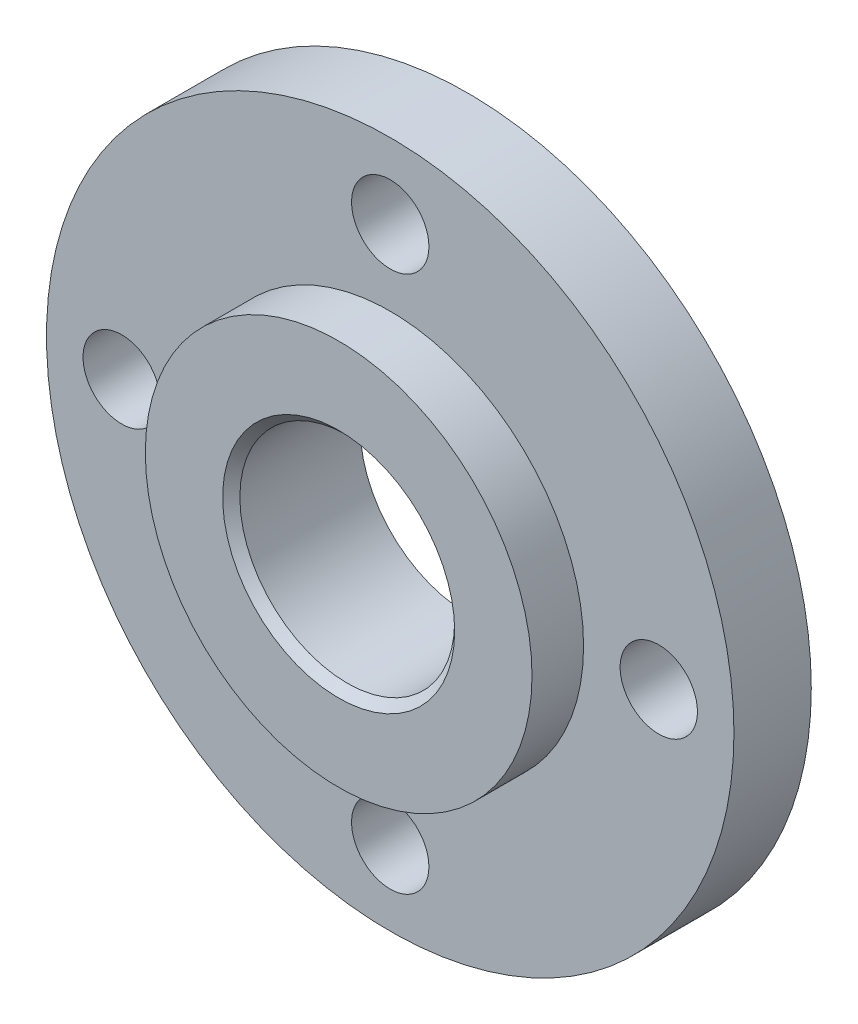
ISO-10303-21;
HEADER;
FILE_DESCRIPTION(('STEP AP214'),'2;1');
FILE_NAME('part.step','',(''),(''),'','','');
FILE_SCHEMA(('AUTOMOTIVE_DESIGN { 1 0 10303 214 1 1 1 1 }'));
ENDSEC;
DATA;
#1=APPLICATION_CONTEXT('core data for automotive mechanical design processes');
#2=APPLICATION_PROTOCOL_DEFINITION('international standard','automotive_design',2000,#1);
#3=PRODUCT_CONTEXT('',#1,'mechanical');
#4=PRODUCT('Part','Part','',(#3));
#5=PRODUCT_RELATED_PRODUCT_CATEGORY('part','',(#4));
#6=PRODUCT_DEFINITION_FORMATION('','',#4);
#7=PRODUCT_DEFINITION_CONTEXT('part definition',#1,'design');
#8=PRODUCT_DEFINITION('design','',#6,#7);
#9=PRODUCT_DEFINITION_SHAPE('','',#8);
#10=(LENGTH_UNIT() NAMED_UNIT(*) SI_UNIT(.MILLI.,.METRE.));
#11=(NAMED_UNIT(*) PLANE_ANGLE_UNIT() SI_UNIT($,.RADIAN.));
#12=(NAMED_UNIT(*) SI_UNIT($,.STERADIAN.) SOLID_ANGLE_UNIT());
#13=UNCERTAINTY_MEASURE_WITH_UNIT(LENGTH_MEASURE(1.E-05),#10,'distance_accuracy_value','');
#14=(GEOMETRIC_REPRESENTATION_CONTEXT(3) GLOBAL_UNCERTAINTY_ASSIGNED_CONTEXT((#13)) GLOBAL_UNIT_ASSIGNED_CONTEXT((#10,
#11,#12)) REPRESENTATION_CONTEXT('',''));
#15=CARTESIAN_POINT('',(0.,0.,0.));
#16=DIRECTION('',(0.,0.,1.));
#17=DIRECTION('',(1.,0.,0.));
#18=AXIS2_PLACEMENT_3D('',#15,#16,#17);
#19=CARTESIAN_POINT('',(0.,0.,18.));
#20=DIRECTION('',(0.,0.,-1.));
#21=DIRECTION('',(-1.,0.,0.));
#22=AXIS2_PLACEMENT_3D('',#19,#20,#21);
#23=CYLINDRICAL_SURFACE('',#22,80.);
#24=CARTESIAN_POINT('',(0.,0.,18.));
#25=DIRECTION('',(0.,0.,1.));
#26=DIRECTION('',(1.,0.,0.));
#27=AXIS2_PLACEMENT_3D('',#24,#25,#26);
#28=CIRCLE('',#27,80.);
#29=CARTESIAN_POINT('',(80.,0.,18.));
#30=VERTEX_POINT('',#29);
#31=EDGE_CURVE('E71',#30,#30,#28,.T.);
#32=ORIENTED_EDGE('',*,*,#31,.F.);
#33=EDGE_LOOP('',(#32));
#34=FACE_BOUND('',#33,.T.);
#35=CARTESIAN_POINT('',(0.,0.,0.));
#36=DIRECTION('',(0.,0.,1.));
#37=DIRECTION('',(1.,0.,0.));
#38=AXIS2_PLACEMENT_3D('',#35,#36,#37);
#39=CIRCLE('',#38,80.);
#40=CARTESIAN_POINT('',(80.,0.,0.));
#41=VERTEX_POINT('',#40);
#42=EDGE_CURVE('E78',#41,#41,#39,.T.);
#43=ORIENTED_EDGE('',*,*,#42,.T.);
#44=EDGE_LOOP('',(#43));
#45=FACE_BOUND('',#44,.T.);
#46=ADVANCED_FACE('F55',(#34,#45),#23,.T.);
#47=CARTESIAN_POINT('',(0.,0.,18.));
#48=DIRECTION('',(0.,0.,1.));
#49=DIRECTION('',(1.,0.,0.));
#50=AXIS2_PLACEMENT_3D('',#47,#48,#49);
#51=PLANE('',#50);
#52=CARTESIAN_POINT('',(62.5,0.,18.));
#53=DIRECTION('',(0.,0.,1.));
#54=DIRECTION('',(1.,0.,0.));
#55=AXIS2_PLACEMENT_3D('',#52,#53,#54);
#56=CIRCLE('',#55,9.00000000000001);
#57=CARTESIAN_POINT('',(71.5,0.,18.));
#58=VERTEX_POINT('',#57);
#59=EDGE_CURVE('E96',#58,#58,#56,.F.);
#60=ORIENTED_EDGE('',*,*,#59,.T.);
#61=EDGE_LOOP('',(#60));
#62=FACE_BOUND('',#61,.T.);
#63=CARTESIAN_POINT('',(0.,62.5,18.));
#64=DIRECTION('',(0.,0.,1.));
#65=DIRECTION('',(1.,0.,0.));
#66=AXIS2_PLACEMENT_3D('',#63,#64,#65);
#67=CIRCLE('',#66,9.00000000000001);
#68=CARTESIAN_POINT('',(9.00000000000001,62.5,18.));
#69=VERTEX_POINT('',#68);
#70=EDGE_CURVE('E100',#69,#69,#67,.F.);
#71=ORIENTED_EDGE('',*,*,#70,.T.);
#72=EDGE_LOOP('',(#71));
#73=FACE_BOUND('',#72,.T.);
#74=CARTESIAN_POINT('',(-62.5,0.,18.));
#75=DIRECTION('',(0.,0.,1.));
#76=DIRECTION('',(1.,0.,0.));
#77=AXIS2_PLACEMENT_3D('',#74,#75,#76);
#78=CIRCLE('',#77,9.);
#79=CARTESIAN_POINT('',(-53.5,0.,18.));
#80=VERTEX_POINT('',#79);
#81=EDGE_CURVE('E104',#80,#80,#78,.F.);
#82=ORIENTED_EDGE('',*,*,#81,.T.);
#83=EDGE_LOOP('',(#82));
#84=FACE_BOUND('',#83,.T.);
#85=CARTESIAN_POINT('',(0.,-62.5,18.));
#86=DIRECTION('',(0.,0.,1.));
#87=DIRECTION('',(1.,0.,0.));
#88=AXIS2_PLACEMENT_3D('',#85,#86,#87);
#89=CIRCLE('',#88,8.99999999999999);
#90=CARTESIAN_POINT('',(8.99999999999999,-62.5,18.));
#91=VERTEX_POINT('',#90);
#92=EDGE_CURVE('E108',#91,#91,#89,.F.);
#93=ORIENTED_EDGE('',*,*,#92,.T.);
#94=EDGE_LOOP('',(#93));
#95=FACE_BOUND('',#94,.T.);
#96=CARTESIAN_POINT('',(0.,0.,18.));
#97=DIRECTION('',(0.,0.,1.));
#98=DIRECTION('',(1.,0.,0.));
#99=AXIS2_PLACEMENT_3D('',#96,#97,#98);
#100=CIRCLE('',#99,45.);
#101=CARTESIAN_POINT('',(45.,0.,18.));
#102=VERTEX_POINT('',#101);
#103=EDGE_CURVE('E83',#102,#102,#100,.F.);
#104=ORIENTED_EDGE('',*,*,#103,.T.);
#105=EDGE_LOOP('',(#104));
#106=FACE_BOUND('',#105,.T.);
#107=ORIENTED_EDGE('',*,*,#31,.T.);
#108=EDGE_LOOP('',(#107));
#109=FACE_BOUND('',#108,.T.);
#110=ADVANCED_FACE('F149',(#62,#73,#84,#95,#106,#109),#51,.T.);
#111=CARTESIAN_POINT('',(0.,0.,0.));
#112=DIRECTION('',(0.,0.,1.));
#113=DIRECTION('',(1.,0.,0.));
#114=AXIS2_PLACEMENT_3D('',#111,#112,#113);
#115=PLANE('',#114);
#116=CARTESIAN_POINT('',(62.5,0.,0.));
#117=DIRECTION('',(0.,0.,1.));
#118=DIRECTION('',(1.,0.,0.));
#119=AXIS2_PLACEMENT_3D('',#116,#117,#118);
#120=CIRCLE('',#119,9.00000000000001);
#121=CARTESIAN_POINT('',(71.5,0.,0.));
#122=VERTEX_POINT('',#121);
#123=EDGE_CURVE('E112',#122,#122,#120,.T.);
#124=ORIENTED_EDGE('',*,*,#123,.T.);
#125=EDGE_LOOP('',(#124));
#126=FACE_BOUND('',#125,.T.);
#127=CARTESIAN_POINT('',(0.,62.5,0.));
#128=DIRECTION('',(0.,0.,1.));
#129=DIRECTION('',(1.,0.,0.));
#130=AXIS2_PLACEMENT_3D('',#127,#128,#129);
#131=CIRCLE('',#130,9.00000000000001);
#132=CARTESIAN_POINT('',(9.00000000000001,62.5,0.));
#133=VERTEX_POINT('',#132);
#134=EDGE_CURVE('E121',#133,#133,#131,.T.);
#135=ORIENTED_EDGE('',*,*,#134,.T.);
#136=EDGE_LOOP('',(#135));
#137=FACE_BOUND('',#136,.T.);
#138=CARTESIAN_POINT('',(-62.5,0.,0.));
#139=DIRECTION('',(0.,0.,1.));
#140=DIRECTION('',(1.,0.,0.));
#141=AXIS2_PLACEMENT_3D('',#138,#139,#140);
#142=CIRCLE('',#141,9.);
#143=CARTESIAN_POINT('',(-53.5,0.,0.));
#144=VERTEX_POINT('',#143);
#145=EDGE_CURVE('E117',#144,#144,#142,.T.);
#146=ORIENTED_EDGE('',*,*,#145,.T.);
#147=EDGE_LOOP('',(#146));
#148=FACE_BOUND('',#147,.T.);
#149=CARTESIAN_POINT('',(0.,-62.5,0.));
#150=DIRECTION('',(0.,0.,1.));
#151=DIRECTION('',(1.,0.,0.));
#152=AXIS2_PLACEMENT_3D('',#149,#150,#151);
#153=CIRCLE('',#152,8.99999999999999);
#154=CARTESIAN_POINT('',(8.99999999999999,-62.5,0.));
#155=VERTEX_POINT('',#154);
#156=EDGE_CURVE('E113',#155,#155,#153,.T.);
#157=ORIENTED_EDGE('',*,*,#156,.T.);
#158=EDGE_LOOP('',(#157));
#159=FACE_BOUND('',#158,.T.);
#160=CARTESIAN_POINT('',(0.,0.,0.));
#161=DIRECTION('',(0.,0.,1.));
#162=DIRECTION('',(1.,0.,0.));
#163=AXIS2_PLACEMENT_3D('',#160,#161,#162);
#164=CIRCLE('',#163,25.);
#165=CARTESIAN_POINT('',(25.,0.,0.));
#166=VERTEX_POINT('',#165);
#167=EDGE_CURVE('E92',#166,#166,#164,.T.);
#168=ORIENTED_EDGE('',*,*,#167,.T.);
#169=EDGE_LOOP('',(#168));
#170=FACE_BOUND('',#169,.T.);
#171=ORIENTED_EDGE('',*,*,#42,.F.);
#172=EDGE_LOOP('',(#171));
#173=FACE_BOUND('',#172,.T.);
#174=ADVANCED_FACE('F131',(#126,#137,#148,#159,#170,#173),#115,.F.);
#175=CARTESIAN_POINT('',(0.,0.,30.));
#176=DIRECTION('',(0.,0.,-1.));
#177=DIRECTION('',(-1.,0.,0.));
#178=AXIS2_PLACEMENT_3D('',#175,#176,#177);
#179=CYLINDRICAL_SURFACE('',#178,45.);
#180=ORIENTED_EDGE('',*,*,#103,.F.);
#181=EDGE_LOOP('',(#180));
#182=FACE_BOUND('',#181,.T.);
#183=CARTESIAN_POINT('',(0.,0.,30.));
#184=DIRECTION('',(0.,0.,1.));
#185=DIRECTION('',(1.,0.,0.));
#186=AXIS2_PLACEMENT_3D('',#183,#184,#185);
#187=CIRCLE('',#186,45.);
#188=CARTESIAN_POINT('',(45.,0.,30.));
#189=VERTEX_POINT('',#188);
#190=EDGE_CURVE('E88',#189,#189,#187,.T.);
#191=ORIENTED_EDGE('',*,*,#190,.F.);
#192=EDGE_LOOP('',(#191));
#193=FACE_BOUND('',#192,.T.);
#194=ADVANCED_FACE('F160',(#182,#193),#179,.T.);
#195=CARTESIAN_POINT('',(0.,0.,30.));
#196=DIRECTION('',(0.,0.,1.));
#197=DIRECTION('',(1.,0.,0.));
#198=AXIS2_PLACEMENT_3D('',#195,#196,#197);
#199=PLANE('',#198);
#200=CARTESIAN_POINT('',(0.,0.,30.));
#201=DIRECTION('',(0.,0.,1.));
#202=DIRECTION('',(1.,0.,0.));
#203=AXIS2_PLACEMENT_3D('',#200,#201,#202);
#204=CIRCLE('',#203,27.);
#205=CARTESIAN_POINT('',(27.,0.,30.));
#206=VERTEX_POINT('',#205);
#207=EDGE_CURVE('E12',#206,#206,#204,.F.);
#208=ORIENTED_EDGE('',*,*,#207,.T.);
#209=EDGE_LOOP('',(#208));
#210=FACE_BOUND('',#209,.T.);
#211=ORIENTED_EDGE('',*,*,#190,.T.);
#212=EDGE_LOOP('',(#211));
#213=FACE_BOUND('',#212,.T.);
#214=ADVANCED_FACE('F164',(#210,#213),#199,.T.);
#215=CARTESIAN_POINT('',(0.,0.,30.));
#216=DIRECTION('',(0.,0.,-1.));
#217=DIRECTION('',(-1.,0.,0.));
#218=AXIS2_PLACEMENT_3D('',#215,#216,#217);
#219=CYLINDRICAL_SURFACE('',#218,25.);
#220=CARTESIAN_POINT('',(0.,0.,28.0000000000001));
#221=DIRECTION('',(0.,0.,1.));
#222=DIRECTION('',(1.,0.,0.));
#223=AXIS2_PLACEMENT_3D('',#220,#221,#222);
#224=CIRCLE('',#223,25.);
#225=CARTESIAN_POINT('',(25.,0.,28.0000000000001));
#226=VERTEX_POINT('',#225);
#227=EDGE_CURVE('E64',#226,#226,#224,.T.);
#228=ORIENTED_EDGE('',*,*,#227,.T.);
#229=EDGE_LOOP('',(#228));
#230=FACE_BOUND('',#229,.T.);
#231=ORIENTED_EDGE('',*,*,#167,.F.);
#232=EDGE_LOOP('',(#231));
#233=FACE_BOUND('',#232,.T.);
#234=ADVANCED_FACE('F168',(#230,#233),#219,.F.);
#235=CARTESIAN_POINT('',(0.,-62.5,30.));
#236=DIRECTION('',(0.,0.,-1.));
#237=DIRECTION('',(-1.,0.,0.));
#238=AXIS2_PLACEMENT_3D('',#235,#236,#237);
#239=CYLINDRICAL_SURFACE('',#238,8.99999999999999);
#240=ORIENTED_EDGE('',*,*,#92,.F.);
#241=EDGE_LOOP('',(#240));
#242=FACE_BOUND('',#241,.T.);
#243=ORIENTED_EDGE('',*,*,#156,.F.);
#244=EDGE_LOOP('',(#243));
#245=FACE_BOUND('',#244,.T.);
#246=ADVANCED_FACE('F171',(#242,#245),#239,.F.);
#247=CARTESIAN_POINT('',(-62.5,0.,30.));
#248=DIRECTION('',(0.,0.,-1.));
#249=DIRECTION('',(-1.,0.,0.));
#250=AXIS2_PLACEMENT_3D('',#247,#248,#249);
#251=CYLINDRICAL_SURFACE('',#250,9.);
#252=ORIENTED_EDGE('',*,*,#81,.F.);
#253=EDGE_LOOP('',(#252));
#254=FACE_BOUND('',#253,.T.);
#255=ORIENTED_EDGE('',*,*,#145,.F.);
#256=EDGE_LOOP('',(#255));
#257=FACE_BOUND('',#256,.T.);
#258=ADVANCED_FACE('F144',(#254,#257),#251,.F.);
#259=CARTESIAN_POINT('',(0.,62.5,30.));
#260=DIRECTION('',(0.,0.,-1.));
#261=DIRECTION('',(-1.,0.,0.));
#262=AXIS2_PLACEMENT_3D('',#259,#260,#261);
#263=CYLINDRICAL_SURFACE('',#262,9.00000000000001);
#264=ORIENTED_EDGE('',*,*,#70,.F.);
#265=EDGE_LOOP('',(#264));
#266=FACE_BOUND('',#265,.T.);
#267=ORIENTED_EDGE('',*,*,#134,.F.);
#268=EDGE_LOOP('',(#267));
#269=FACE_BOUND('',#268,.T.);
#270=ADVANCED_FACE('F136',(#266,#269),#263,.F.);
#271=CARTESIAN_POINT('',(62.5,0.,30.));
#272=DIRECTION('',(0.,0.,-1.));
#273=DIRECTION('',(-1.,0.,0.));
#274=AXIS2_PLACEMENT_3D('',#271,#272,#273);
#275=CYLINDRICAL_SURFACE('',#274,9.00000000000001);
#276=ORIENTED_EDGE('',*,*,#59,.F.);
#277=EDGE_LOOP('',(#276));
#278=FACE_BOUND('',#277,.T.);
#279=ORIENTED_EDGE('',*,*,#123,.F.);
#280=EDGE_LOOP('',(#279));
#281=FACE_BOUND('',#280,.T.);
#282=ADVANCED_FACE('F134',(#278,#281),#275,.F.);
#283=CARTESIAN_POINT('',(0.,0.,28.0000000000001));
#284=DIRECTION('',(0.,0.,1.));
#285=DIRECTION('',(1.,0.,0.));
#286=AXIS2_PLACEMENT_3D('',#283,#284,#285);
#287=CONICAL_SURFACE('',#286,25.,0.785398163397454);
#288=ORIENTED_EDGE('',*,*,#207,.F.);
#289=EDGE_LOOP('',(#288));
#290=FACE_BOUND('',#289,.T.);
#291=ORIENTED_EDGE('',*,*,#227,.F.);
#292=EDGE_LOOP('',(#291));
#293=FACE_BOUND('',#292,.T.);
#294=ADVANCED_FACE('F58',(#290,#293),#287,.F.);
#295=CLOSED_SHELL('',(#46,#110,#174,#194,#214,#234,#246,#258,#270,#282,#294));
#296=MANIFOLD_SOLID_BREP('B2',#295);
#297=ADVANCED_BREP_SHAPE_REPRESENTATION('',(#18,#296),#14);
#298=SHAPE_DEFINITION_REPRESENTATION(#9,#297);
ENDSEC;
END-ISO-10303-21;
